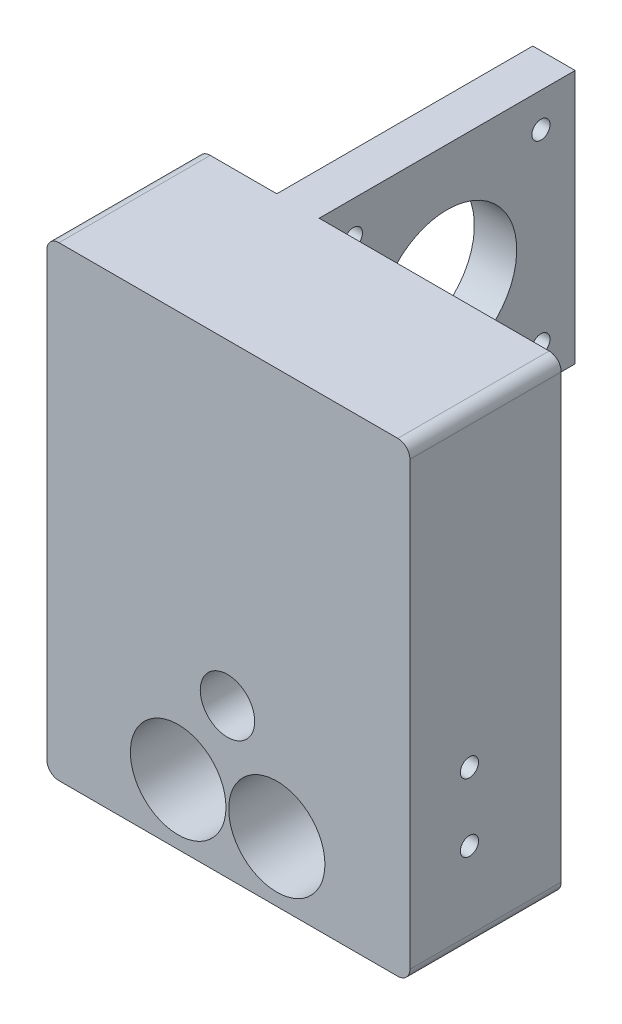
ISO-10303-21;
HEADER;
FILE_DESCRIPTION(('STEP AP214'),'2;1');
FILE_NAME('part.step','',(''),(''),'','','');
FILE_SCHEMA(('AUTOMOTIVE_DESIGN { 1 0 10303 214 1 1 1 1 }'));
ENDSEC;
DATA;
#1=APPLICATION_CONTEXT('core data for automotive mechanical design processes');
#2=APPLICATION_PROTOCOL_DEFINITION('international standard','automotive_design',2000,#1);
#3=PRODUCT_CONTEXT('',#1,'mechanical');
#4=PRODUCT('Part','Part','',(#3));
#5=PRODUCT_RELATED_PRODUCT_CATEGORY('part','',(#4));
#6=PRODUCT_DEFINITION_FORMATION('','',#4);
#7=PRODUCT_DEFINITION_CONTEXT('part definition',#1,'design');
#8=PRODUCT_DEFINITION('design','',#6,#7);
#9=PRODUCT_DEFINITION_SHAPE('','',#8);
#10=(LENGTH_UNIT() NAMED_UNIT(*) SI_UNIT(.MILLI.,.METRE.));
#11=(NAMED_UNIT(*) PLANE_ANGLE_UNIT() SI_UNIT($,.RADIAN.));
#12=(NAMED_UNIT(*) SI_UNIT($,.STERADIAN.) SOLID_ANGLE_UNIT());
#13=UNCERTAINTY_MEASURE_WITH_UNIT(LENGTH_MEASURE(1.E-05),#10,'distance_accuracy_value','');
#14=(GEOMETRIC_REPRESENTATION_CONTEXT(3) GLOBAL_UNCERTAINTY_ASSIGNED_CONTEXT((#13)) GLOBAL_UNIT_ASSIGNED_CONTEXT((#10,
#11,#12)) REPRESENTATION_CONTEXT('',''));
#15=CARTESIAN_POINT('',(0.,0.,0.));
#16=DIRECTION('',(0.,0.,1.));
#17=DIRECTION('',(1.,0.,0.));
#18=AXIS2_PLACEMENT_3D('',#15,#16,#17);
#19=CARTESIAN_POINT('',(69.8451343283582,24.6422595891986,25.));
#20=DIRECTION('',(0.,0.,-1.));
#21=DIRECTION('',(-1.,0.,0.));
#22=AXIS2_PLACEMENT_3D('',#19,#20,#21);
#23=CYLINDRICAL_SURFACE('',#22,4.5);
#24=CARTESIAN_POINT('',(69.8451343283582,24.6422595891986,25.));
#25=DIRECTION('',(0.,0.,1.));
#26=DIRECTION('',(1.,0.,0.));
#27=AXIS2_PLACEMENT_3D('',#24,#25,#26);
#28=CIRCLE('',#27,4.5);
#29=CARTESIAN_POINT('',(74.3451343283582,24.6422595891986,25.));
#30=VERTEX_POINT('',#29);
#31=EDGE_CURVE('E212',#30,#30,#28,.T.);
#32=ORIENTED_EDGE('',*,*,#31,.T.);
#33=EDGE_LOOP('',(#32));
#34=FACE_BOUND('',#33,.T.);
#35=CARTESIAN_POINT('',(69.8451343283582,24.6422595891986,7.5));
#36=DIRECTION('',(0.,0.,-1.));
#37=DIRECTION('',(-1.,0.,0.));
#38=AXIS2_PLACEMENT_3D('',#35,#36,#37);
#39=CIRCLE('',#38,4.5);
#40=CARTESIAN_POINT('',(65.3451343283582,24.6422595891986,7.5));
#41=VERTEX_POINT('',#40);
#42=EDGE_CURVE('E253',#41,#41,#39,.T.);
#43=ORIENTED_EDGE('',*,*,#42,.T.);
#44=EDGE_LOOP('',(#43));
#45=FACE_BOUND('',#44,.T.);
#46=ADVANCED_FACE('F35',(#34,#45),#23,.F.);
#47=CARTESIAN_POINT('',(0.,0.,25.));
#48=DIRECTION('',(0.,1.,0.));
#49=DIRECTION('',(0.,0.,1.));
#50=AXIS2_PLACEMENT_3D('',#47,#48,#49);
#51=PLANE('',#50);
#52=CARTESIAN_POINT('',(48.,0.,12.5));
#53=DIRECTION('',(0.,1.,0.));
#54=DIRECTION('',(0.,0.,1.));
#55=AXIS2_PLACEMENT_3D('',#52,#53,#54);
#56=CIRCLE('',#55,4.3);
#57=CARTESIAN_POINT('',(48.,0.,16.8));
#58=VERTEX_POINT('',#57);
#59=EDGE_CURVE('E204',#58,#58,#56,.T.);
#60=ORIENTED_EDGE('',*,*,#59,.T.);
#61=EDGE_LOOP('',(#60));
#62=FACE_BOUND('',#61,.T.);
#63=CARTESIAN_POINT('',(92.,0.,12.5));
#64=DIRECTION('',(0.,1.,0.));
#65=DIRECTION('',(0.,0.,1.));
#66=AXIS2_PLACEMENT_3D('',#63,#64,#65);
#67=CIRCLE('',#66,4.3);
#68=CARTESIAN_POINT('',(92.,0.,16.8));
#69=VERTEX_POINT('',#68);
#70=EDGE_CURVE('E205',#69,#69,#67,.T.);
#71=ORIENTED_EDGE('',*,*,#70,.T.);
#72=EDGE_LOOP('',(#71));
#73=FACE_BOUND('',#72,.T.);
#74=DIRECTION('',(1.,0.,0.));
#75=VECTOR('',#74,1.);
#76=CARTESIAN_POINT('',(0.,0.,25.));
#77=LINE('',#76,#75);
#78=CARTESIAN_POINT('',(42.,0.,25.));
#79=VERTEX_POINT('',#78);
#80=CARTESIAN_POINT('',(98.,0.,25.));
#81=VERTEX_POINT('',#80);
#82=EDGE_CURVE('E230',#79,#81,#77,.T.);
#83=ORIENTED_EDGE('',*,*,#82,.F.);
#84=DIRECTION('',(0.,0.,-1.));
#85=VECTOR('',#84,1.);
#86=CARTESIAN_POINT('',(42.,0.,0.));
#87=LINE('',#86,#85);
#88=CARTESIAN_POINT('',(42.,0.,0.));
#89=VERTEX_POINT('',#88);
#90=EDGE_CURVE('E11',#79,#89,#87,.T.);
#91=ORIENTED_EDGE('',*,*,#90,.T.);
#92=DIRECTION('',(1.,0.,0.));
#93=VECTOR('',#92,1.);
#94=CARTESIAN_POINT('',(0.,0.,0.));
#95=LINE('',#94,#93);
#96=CARTESIAN_POINT('',(98.,0.,0.));
#97=VERTEX_POINT('',#96);
#98=EDGE_CURVE('E227',#89,#97,#95,.T.);
#99=ORIENTED_EDGE('',*,*,#98,.T.);
#100=DIRECTION('',(0.,0.,-1.));
#101=VECTOR('',#100,1.);
#102=CARTESIAN_POINT('',(98.,0.,25.));
#103=LINE('',#102,#101);
#104=EDGE_CURVE('E43',#97,#81,#103,.F.);
#105=ORIENTED_EDGE('',*,*,#104,.T.);
#106=EDGE_LOOP('',(#83,#91,#99,#105));
#107=FACE_BOUND('',#106,.T.);
#108=ADVANCED_FACE('F433',(#62,#73,#107),#51,.F.);
#109=CARTESIAN_POINT('',(0.,0.,25.));
#110=DIRECTION('',(0.,0.,-1.));
#111=DIRECTION('',(-1.,0.,0.));
#112=AXIS2_PLACEMENT_3D('',#109,#110,#111);
#113=PLANE('',#112);
#114=CARTESIAN_POINT('',(61.7000008998014,9.99458395683269,25.));
#115=DIRECTION('',(0.,0.,1.));
#116=DIRECTION('',(1.,0.,0.));
#117=AXIS2_PLACEMENT_3D('',#114,#115,#116);
#118=CIRCLE('',#117,7.9);
#119=CARTESIAN_POINT('',(69.6000008998014,9.99458395683269,25.));
#120=VERTEX_POINT('',#119);
#121=EDGE_CURVE('E224',#120,#120,#118,.T.);
#122=ORIENTED_EDGE('',*,*,#121,.F.);
#123=EDGE_LOOP('',(#122));
#124=FACE_BOUND('',#123,.T.);
#125=ORIENTED_EDGE('',*,*,#31,.F.);
#126=EDGE_LOOP('',(#125));
#127=FACE_BOUND('',#126,.T.);
#128=CARTESIAN_POINT('',(78.,10.,25.));
#129=DIRECTION('',(0.,0.,1.));
#130=DIRECTION('',(1.,0.,0.));
#131=AXIS2_PLACEMENT_3D('',#128,#129,#130);
#132=CIRCLE('',#131,7.95);
#133=CARTESIAN_POINT('',(85.95,10.,25.));
#134=VERTEX_POINT('',#133);
#135=EDGE_CURVE('E215',#134,#134,#132,.T.);
#136=ORIENTED_EDGE('',*,*,#135,.F.);
#137=EDGE_LOOP('',(#136));
#138=FACE_BOUND('',#137,.T.);
#139=DIRECTION('',(0.,1.,0.));
#140=VECTOR('',#139,1.);
#141=CARTESIAN_POINT('',(100.,0.,25.));
#142=LINE('',#141,#140);
#143=CARTESIAN_POINT('',(100.,2.,25.));
#144=VERTEX_POINT('',#143);
#145=CARTESIAN_POINT('',(100.,74.9999999999998,25.));
#146=VERTEX_POINT('',#145);
#147=EDGE_CURVE('E232',#144,#146,#142,.T.);
#148=ORIENTED_EDGE('',*,*,#147,.T.);
#149=CARTESIAN_POINT('',(98.,74.9999999999998,25.));
#150=DIRECTION('',(0.,0.,-1.));
#151=DIRECTION('',(-1.,0.,0.));
#152=AXIS2_PLACEMENT_3D('',#149,#150,#151);
#153=CIRCLE('',#152,2.);
#154=CARTESIAN_POINT('',(98.,77.,25.));
#155=VERTEX_POINT('',#154);
#156=EDGE_CURVE('E278',#146,#155,#153,.F.);
#157=ORIENTED_EDGE('',*,*,#156,.T.);
#158=DIRECTION('',(-1.,0.,0.));
#159=VECTOR('',#158,1.);
#160=CARTESIAN_POINT('',(100.,77.,25.));
#161=LINE('',#160,#159);
#162=CARTESIAN_POINT('',(42.,77.,25.));
#163=VERTEX_POINT('',#162);
#164=EDGE_CURVE('E172',#155,#163,#161,.T.);
#165=ORIENTED_EDGE('',*,*,#164,.T.);
#166=CARTESIAN_POINT('',(42.,75.0000000000001,25.));
#167=DIRECTION('',(0.,0.,-1.));
#168=DIRECTION('',(-1.,0.,0.));
#169=AXIS2_PLACEMENT_3D('',#166,#167,#168);
#170=CIRCLE('',#169,2.);
#171=CARTESIAN_POINT('',(40.,75.0000000000001,25.));
#172=VERTEX_POINT('',#171);
#173=EDGE_CURVE('E276',#163,#172,#170,.F.);
#174=ORIENTED_EDGE('',*,*,#173,.T.);
#175=DIRECTION('',(0.,1.,0.));
#176=VECTOR('',#175,1.);
#177=CARTESIAN_POINT('',(40.,0.,25.));
#178=LINE('',#177,#176);
#179=CARTESIAN_POINT('',(40.,2.,25.));
#180=VERTEX_POINT('',#179);
#181=EDGE_CURVE('E291',#180,#172,#178,.T.);
#182=ORIENTED_EDGE('',*,*,#181,.F.);
#183=CARTESIAN_POINT('',(42.,2.,25.));
#184=DIRECTION('',(0.,0.,-1.));
#185=DIRECTION('',(-1.,0.,0.));
#186=AXIS2_PLACEMENT_3D('',#183,#184,#185);
#187=CIRCLE('',#186,2.);
#188=EDGE_CURVE('E56',#180,#79,#187,.F.);
#189=ORIENTED_EDGE('',*,*,#188,.T.);
#190=ORIENTED_EDGE('',*,*,#82,.T.);
#191=CARTESIAN_POINT('',(98.,2.,25.));
#192=DIRECTION('',(0.,0.,-1.));
#193=DIRECTION('',(-1.,0.,0.));
#194=AXIS2_PLACEMENT_3D('',#191,#192,#193);
#195=CIRCLE('',#194,2.);
#196=EDGE_CURVE('E273',#81,#144,#195,.F.);
#197=ORIENTED_EDGE('',*,*,#196,.T.);
#198=EDGE_LOOP('',(#148,#157,#165,#174,#182,#189,#190,#197));
#199=FACE_BOUND('',#198,.T.);
#200=ADVANCED_FACE('F330',(#124,#127,#138,#199),#113,.F.);
#201=CARTESIAN_POINT('',(0.,0.,0.));
#202=DIRECTION('',(0.,0.,-1.));
#203=DIRECTION('',(-1.,0.,0.));
#204=AXIS2_PLACEMENT_3D('',#201,#202,#203);
#205=PLANE('',#204);
#206=DIRECTION('',(-1.,0.,0.));
#207=VECTOR('',#206,1.);
#208=CARTESIAN_POINT('',(100.,77.,0.));
#209=LINE('',#208,#207);
#210=CARTESIAN_POINT('',(98.,77.,0.));
#211=VERTEX_POINT('',#210);
#212=CARTESIAN_POINT('',(60.,77.,0.));
#213=VERTEX_POINT('',#212);
#214=EDGE_CURVE('E161',#211,#213,#209,.T.);
#215=ORIENTED_EDGE('',*,*,#214,.F.);
#216=CARTESIAN_POINT('',(98.,74.9999999999998,0.));
#217=DIRECTION('',(0.,0.,-1.));
#218=DIRECTION('',(-1.,0.,0.));
#219=AXIS2_PLACEMENT_3D('',#216,#217,#218);
#220=CIRCLE('',#219,2.);
#221=CARTESIAN_POINT('',(100.,74.9999999999998,0.));
#222=VERTEX_POINT('',#221);
#223=EDGE_CURVE('E266',#211,#222,#220,.T.);
#224=ORIENTED_EDGE('',*,*,#223,.T.);
#225=DIRECTION('',(0.,1.,0.));
#226=VECTOR('',#225,1.);
#227=CARTESIAN_POINT('',(100.,0.,0.));
#228=LINE('',#227,#226);
#229=CARTESIAN_POINT('',(100.,2.,0.));
#230=VERTEX_POINT('',#229);
#231=EDGE_CURVE('E233',#230,#222,#228,.T.);
#232=ORIENTED_EDGE('',*,*,#231,.F.);
#233=CARTESIAN_POINT('',(98.,2.,0.));
#234=DIRECTION('',(0.,0.,-1.));
#235=DIRECTION('',(-1.,0.,0.));
#236=AXIS2_PLACEMENT_3D('',#233,#234,#235);
#237=CIRCLE('',#236,2.);
#238=EDGE_CURVE('E260',#230,#97,#237,.T.);
#239=ORIENTED_EDGE('',*,*,#238,.T.);
#240=ORIENTED_EDGE('',*,*,#98,.F.);
#241=CARTESIAN_POINT('',(42.,2.,0.));
#242=DIRECTION('',(0.,0.,-1.));
#243=DIRECTION('',(-1.,0.,0.));
#244=AXIS2_PLACEMENT_3D('',#241,#242,#243);
#245=CIRCLE('',#244,2.);
#246=CARTESIAN_POINT('',(40.,2.,0.));
#247=VERTEX_POINT('',#246);
#248=EDGE_CURVE('E262',#89,#247,#245,.T.);
#249=ORIENTED_EDGE('',*,*,#248,.T.);
#250=DIRECTION('',(0.,1.,0.));
#251=VECTOR('',#250,1.);
#252=CARTESIAN_POINT('',(40.,0.,0.));
#253=LINE('',#252,#251);
#254=CARTESIAN_POINT('',(40.,75.0000000000001,0.));
#255=VERTEX_POINT('',#254);
#256=EDGE_CURVE('E256',#247,#255,#253,.T.);
#257=ORIENTED_EDGE('',*,*,#256,.T.);
#258=CARTESIAN_POINT('',(42.,75.0000000000001,0.));
#259=DIRECTION('',(0.,0.,-1.));
#260=DIRECTION('',(-1.,0.,0.));
#261=AXIS2_PLACEMENT_3D('',#258,#259,#260);
#262=CIRCLE('',#261,2.);
#263=CARTESIAN_POINT('',(42.,77.,0.));
#264=VERTEX_POINT('',#263);
#265=EDGE_CURVE('E264',#255,#264,#262,.T.);
#266=ORIENTED_EDGE('',*,*,#265,.T.);
#267=CARTESIAN_POINT('',(53.,77.,0.));
#268=VERTEX_POINT('',#267);
#269=EDGE_CURVE('E173',#268,#264,#209,.T.);
#270=ORIENTED_EDGE('',*,*,#269,.F.);
#271=DIRECTION('',(0.,-1.,0.));
#272=VECTOR('',#271,1.);
#273=CARTESIAN_POINT('',(53.,77.,0.));
#274=LINE('',#273,#272);
#275=CARTESIAN_POINT('',(53.,35.,0.));
#276=VERTEX_POINT('',#275);
#277=EDGE_CURVE('E183',#268,#276,#274,.T.);
#278=ORIENTED_EDGE('',*,*,#277,.T.);
#279=DIRECTION('',(1.,0.,0.));
#280=VECTOR('',#279,1.);
#281=CARTESIAN_POINT('',(60.,35.,0.));
#282=LINE('',#281,#280);
#283=CARTESIAN_POINT('',(60.,35.,0.));
#284=VERTEX_POINT('',#283);
#285=EDGE_CURVE('E180',#276,#284,#282,.T.);
#286=ORIENTED_EDGE('',*,*,#285,.T.);
#287=DIRECTION('',(0.,1.,0.));
#288=VECTOR('',#287,1.);
#289=CARTESIAN_POINT('',(60.,77.,0.));
#290=LINE('',#289,#288);
#291=EDGE_CURVE('E176',#284,#213,#290,.T.);
#292=ORIENTED_EDGE('',*,*,#291,.T.);
#293=EDGE_LOOP('',(#215,#224,#232,#239,#240,#249,#257,#266,#270,#278,#286,#292));
#294=FACE_BOUND('',#293,.T.);
#295=DIRECTION('',(-0.780451046040336,0.625216894153177,0.));
#296=VECTOR('',#295,1.);
#297=CARTESIAN_POINT('',(68.6838895653523,17.0518153377911,0.));
#298=LINE('',#297,#296);
#299=CARTESIAN_POINT('',(68.6838895653523,17.0518153377911,0.));
#300=VERTEX_POINT('',#299);
#301=CARTESIAN_POINT('',(62.6909943991268,21.8527049282696,0.));
#302=VERTEX_POINT('',#301);
#303=EDGE_CURVE('E352',#300,#302,#298,.T.);
#304=ORIENTED_EDGE('',*,*,#303,.F.);
#305=DIRECTION('',(-0.931679236232026,-0.363281985204481,0.));
#306=VECTOR('',#305,1.);
#307=CARTESIAN_POINT('',(75.8380294945837,19.8413699987201,0.));
#308=LINE('',#307,#306);
#309=CARTESIAN_POINT('',(75.8380294945837,19.8413699987201,0.));
#310=VERTEX_POINT('',#309);
#311=EDGE_CURVE('E357',#310,#300,#308,.T.);
#312=ORIENTED_EDGE('',*,*,#311,.F.);
#313=DIRECTION('',(-0.15122819019169,-0.988498879357658,0.));
#314=VECTOR('',#313,1.);
#315=CARTESIAN_POINT('',(76.9992742575896,27.4318142501276,0.));
#316=LINE('',#315,#314);
#317=CARTESIAN_POINT('',(76.9992742575896,27.4318142501276,0.));
#318=VERTEX_POINT('',#317);
#319=EDGE_CURVE('E383',#318,#310,#316,.T.);
#320=ORIENTED_EDGE('',*,*,#319,.F.);
#321=DIRECTION('',(0.780451046040336,-0.625216894153177,0.));
#322=VECTOR('',#321,1.);
#323=CARTESIAN_POINT('',(71.0063790913641,32.2327038406061,0.));
#324=LINE('',#323,#322);
#325=CARTESIAN_POINT('',(71.0063790913641,32.2327038406061,0.));
#326=VERTEX_POINT('',#325);
#327=EDGE_CURVE('E380',#326,#318,#324,.T.);
#328=ORIENTED_EDGE('',*,*,#327,.F.);
#329=DIRECTION('',(0.931679236232026,0.363281985204481,0.));
#330=VECTOR('',#329,1.);
#331=CARTESIAN_POINT('',(63.8522391621327,29.4431491796771,0.));
#332=LINE('',#331,#330);
#333=CARTESIAN_POINT('',(63.8522391621327,29.4431491796771,0.));
#334=VERTEX_POINT('',#333);
#335=EDGE_CURVE('E377',#334,#326,#332,.T.);
#336=ORIENTED_EDGE('',*,*,#335,.F.);
#337=DIRECTION('',(0.15122819019169,0.988498879357658,0.));
#338=VECTOR('',#337,1.);
#339=CARTESIAN_POINT('',(62.6909943991268,21.8527049282696,0.));
#340=LINE('',#339,#338);
#341=EDGE_CURVE('E374',#302,#334,#340,.T.);
#342=ORIENTED_EDGE('',*,*,#341,.F.);
#343=EDGE_LOOP('',(#304,#312,#320,#328,#336,#342));
#344=FACE_BOUND('',#343,.T.);
#345=CARTESIAN_POINT('',(78.,10.,0.));
#346=DIRECTION('',(0.,0.,1.));
#347=DIRECTION('',(1.,0.,0.));
#348=AXIS2_PLACEMENT_3D('',#345,#346,#347);
#349=CIRCLE('',#348,7.95);
#350=CARTESIAN_POINT('',(85.95,10.,0.));
#351=VERTEX_POINT('',#350);
#352=EDGE_CURVE('E219',#351,#351,#349,.T.);
#353=ORIENTED_EDGE('',*,*,#352,.T.);
#354=EDGE_LOOP('',(#353));
#355=FACE_BOUND('',#354,.T.);
#356=CARTESIAN_POINT('',(61.7000008998014,9.99458395683269,0.));
#357=DIRECTION('',(0.,0.,1.));
#358=DIRECTION('',(1.,0.,0.));
#359=AXIS2_PLACEMENT_3D('',#356,#357,#358);
#360=CIRCLE('',#359,7.9);
#361=CARTESIAN_POINT('',(69.6000008998014,9.99458395683269,0.));
#362=VERTEX_POINT('',#361);
#363=EDGE_CURVE('E218',#362,#362,#360,.T.);
#364=ORIENTED_EDGE('',*,*,#363,.T.);
#365=EDGE_LOOP('',(#364));
#366=FACE_BOUND('',#365,.T.);
#367=ADVANCED_FACE('F177',(#294,#344,#355,#366),#205,.T.);
#368=CARTESIAN_POINT('',(100.,0.,25.));
#369=DIRECTION('',(-1.,0.,0.));
#370=DIRECTION('',(0.,0.,1.));
#371=AXIS2_PLACEMENT_3D('',#368,#369,#370);
#372=PLANE('',#371);
#373=CARTESIAN_POINT('',(100.,14.7518761899252,15.163954836464));
#374=DIRECTION('',(1.,0.,0.));
#375=DIRECTION('',(0.,0.,-1.));
#376=AXIS2_PLACEMENT_3D('',#373,#374,#375);
#377=CIRCLE('',#376,1.5);
#378=CARTESIAN_POINT('',(100.,14.7518761899252,13.663954836464));
#379=VERTEX_POINT('',#378);
#380=EDGE_CURVE('E332',#379,#379,#377,.T.);
#381=ORIENTED_EDGE('',*,*,#380,.F.);
#382=EDGE_LOOP('',(#381));
#383=FACE_BOUND('',#382,.T.);
#384=CARTESIAN_POINT('',(100.,26.0000000000001,15.163954836464));
#385=DIRECTION('',(1.,0.,0.));
#386=DIRECTION('',(0.,0.,-1.));
#387=AXIS2_PLACEMENT_3D('',#384,#385,#386);
#388=CIRCLE('',#387,1.5);
#389=CARTESIAN_POINT('',(100.,26.0000000000001,13.663954836464));
#390=VERTEX_POINT('',#389);
#391=EDGE_CURVE('E339',#390,#390,#388,.T.);
#392=ORIENTED_EDGE('',*,*,#391,.F.);
#393=EDGE_LOOP('',(#392));
#394=FACE_BOUND('',#393,.T.);
#395=ORIENTED_EDGE('',*,*,#231,.T.);
#396=DIRECTION('',(0.,0.,-1.));
#397=VECTOR('',#396,1.);
#398=CARTESIAN_POINT('',(100.,74.9999999999998,25.));
#399=LINE('',#398,#397);
#400=EDGE_CURVE('E271',#222,#146,#399,.F.);
#401=ORIENTED_EDGE('',*,*,#400,.T.);
#402=ORIENTED_EDGE('',*,*,#147,.F.);
#403=DIRECTION('',(0.,0.,-1.));
#404=VECTOR('',#403,1.);
#405=CARTESIAN_POINT('',(100.,2.,25.));
#406=LINE('',#405,#404);
#407=EDGE_CURVE('E268',#144,#230,#406,.T.);
#408=ORIENTED_EDGE('',*,*,#407,.T.);
#409=EDGE_LOOP('',(#395,#401,#402,#408));
#410=FACE_BOUND('',#409,.T.);
#411=ADVANCED_FACE('F450',(#383,#394,#410),#372,.F.);
#412=CARTESIAN_POINT('',(61.7000008998014,9.99458395683269,25.));
#413=DIRECTION('',(0.,0.,-1.));
#414=DIRECTION('',(-1.,0.,0.));
#415=AXIS2_PLACEMENT_3D('',#412,#413,#414);
#416=CYLINDRICAL_SURFACE('',#415,7.9);
#417=ORIENTED_EDGE('',*,*,#121,.T.);
#418=EDGE_LOOP('',(#417));
#419=FACE_BOUND('',#418,.T.);
#420=ORIENTED_EDGE('',*,*,#363,.F.);
#421=EDGE_LOOP('',(#420));
#422=FACE_BOUND('',#421,.T.);
#423=ADVANCED_FACE('F447',(#419,#422),#416,.F.);
#424=CARTESIAN_POINT('',(78.,10.,25.));
#425=DIRECTION('',(0.,0.,-1.));
#426=DIRECTION('',(-1.,0.,0.));
#427=AXIS2_PLACEMENT_3D('',#424,#425,#426);
#428=CYLINDRICAL_SURFACE('',#427,7.95);
#429=ORIENTED_EDGE('',*,*,#135,.T.);
#430=EDGE_LOOP('',(#429));
#431=FACE_BOUND('',#430,.T.);
#432=ORIENTED_EDGE('',*,*,#352,.F.);
#433=EDGE_LOOP('',(#432));
#434=FACE_BOUND('',#433,.T.);
#435=ADVANCED_FACE('F445',(#431,#434),#428,.F.);
#436=CARTESIAN_POINT('',(48.,10.,12.5));
#437=DIRECTION('',(0.,-1.,0.));
#438=DIRECTION('',(0.,0.,-1.));
#439=AXIS2_PLACEMENT_3D('',#436,#437,#438);
#440=CYLINDRICAL_SURFACE('',#439,4.3);
#441=CARTESIAN_POINT('',(48.,10.,12.5));
#442=DIRECTION('',(0.,1.,0.));
#443=DIRECTION('',(0.,0.,1.));
#444=AXIS2_PLACEMENT_3D('',#441,#442,#443);
#445=CIRCLE('',#444,4.3);
#446=CARTESIAN_POINT('',(48.,10.,16.8));
#447=VERTEX_POINT('',#446);
#448=EDGE_CURVE('E209',#447,#447,#445,.T.);
#449=ORIENTED_EDGE('',*,*,#448,.T.);
#450=EDGE_LOOP('',(#449));
#451=FACE_BOUND('',#450,.T.);
#452=ORIENTED_EDGE('',*,*,#59,.F.);
#453=EDGE_LOOP('',(#452));
#454=FACE_BOUND('',#453,.T.);
#455=ADVANCED_FACE('F732',(#451,#454),#440,.F.);
#456=CARTESIAN_POINT('',(48.,10.,12.5));
#457=DIRECTION('',(0.,1.,0.));
#458=DIRECTION('',(0.,0.,1.));
#459=AXIS2_PLACEMENT_3D('',#456,#457,#458);
#460=PLANE('',#459);
#461=ORIENTED_EDGE('',*,*,#448,.F.);
#462=EDGE_LOOP('',(#461));
#463=FACE_BOUND('',#462,.T.);
#464=ADVANCED_FACE('F722',(#463),#460,.F.);
#465=CARTESIAN_POINT('',(92.,10.,12.5));
#466=DIRECTION('',(0.,-1.,0.));
#467=DIRECTION('',(0.,0.,-1.));
#468=AXIS2_PLACEMENT_3D('',#465,#466,#467);
#469=CYLINDRICAL_SURFACE('',#468,4.3);
#470=CARTESIAN_POINT('',(92.,10.,12.5));
#471=DIRECTION('',(0.,1.,0.));
#472=DIRECTION('',(0.,0.,1.));
#473=AXIS2_PLACEMENT_3D('',#470,#471,#472);
#474=CIRCLE('',#473,4.3);
#475=CARTESIAN_POINT('',(92.,10.,16.8));
#476=VERTEX_POINT('',#475);
#477=EDGE_CURVE('E201',#476,#476,#474,.T.);
#478=ORIENTED_EDGE('',*,*,#477,.T.);
#479=EDGE_LOOP('',(#478));
#480=FACE_BOUND('',#479,.T.);
#481=ORIENTED_EDGE('',*,*,#70,.F.);
#482=EDGE_LOOP('',(#481));
#483=FACE_BOUND('',#482,.T.);
#484=ADVANCED_FACE('F712',(#480,#483),#469,.F.);
#485=CARTESIAN_POINT('',(92.,10.,12.5));
#486=DIRECTION('',(0.,1.,0.));
#487=DIRECTION('',(0.,0.,1.));
#488=AXIS2_PLACEMENT_3D('',#485,#486,#487);
#489=PLANE('',#488);
#490=ORIENTED_EDGE('',*,*,#477,.F.);
#491=EDGE_LOOP('',(#490));
#492=FACE_BOUND('',#491,.T.);
#493=ADVANCED_FACE('F552',(#492),#489,.F.);
#494=CARTESIAN_POINT('',(60.,77.,-42.3));
#495=DIRECTION('',(1.,0.,0.));
#496=DIRECTION('',(0.,1.,0.));
#497=AXIS2_PLACEMENT_3D('',#494,#495,#496);
#498=PLANE('',#497);
#499=CARTESIAN_POINT('',(60.,56.15,-21.15));
#500=DIRECTION('',(1.,0.,0.));
#501=DIRECTION('',(0.,1.,0.));
#502=AXIS2_PLACEMENT_3D('',#499,#500,#501);
#503=CIRCLE('',#502,11.5);
#504=CARTESIAN_POINT('',(60.,67.65,-21.15));
#505=VERTEX_POINT('',#504);
#506=EDGE_CURVE('E349',#505,#505,#503,.T.);
#507=ORIENTED_EDGE('',*,*,#506,.F.);
#508=EDGE_LOOP('',(#507));
#509=FACE_BOUND('',#508,.T.);
#510=CARTESIAN_POINT('',(60.,40.6500000000001,-36.65));
#511=DIRECTION('',(1.,0.,0.));
#512=DIRECTION('',(0.,1.,0.));
#513=AXIS2_PLACEMENT_3D('',#510,#511,#512);
#514=CIRCLE('',#513,1.5);
#515=CARTESIAN_POINT('',(60.,42.1500000000001,-36.65));
#516=VERTEX_POINT('',#515);
#517=EDGE_CURVE('E247',#516,#516,#514,.T.);
#518=ORIENTED_EDGE('',*,*,#517,.F.);
#519=EDGE_LOOP('',(#518));
#520=FACE_BOUND('',#519,.T.);
#521=CARTESIAN_POINT('',(60.,40.6500000000001,-5.65));
#522=DIRECTION('',(1.,0.,0.));
#523=DIRECTION('',(0.,1.,0.));
#524=AXIS2_PLACEMENT_3D('',#521,#522,#523);
#525=CIRCLE('',#524,1.5);
#526=CARTESIAN_POINT('',(60.,42.1500000000001,-5.65));
#527=VERTEX_POINT('',#526);
#528=EDGE_CURVE('E303',#527,#527,#525,.T.);
#529=ORIENTED_EDGE('',*,*,#528,.F.);
#530=EDGE_LOOP('',(#529));
#531=FACE_BOUND('',#530,.T.);
#532=CARTESIAN_POINT('',(60.,71.3500000000001,-5.65));
#533=DIRECTION('',(1.,0.,0.));
#534=DIRECTION('',(0.,1.,0.));
#535=AXIS2_PLACEMENT_3D('',#532,#533,#534);
#536=CIRCLE('',#535,1.5);
#537=CARTESIAN_POINT('',(60.,72.8500000000001,-5.65));
#538=VERTEX_POINT('',#537);
#539=EDGE_CURVE('E297',#538,#538,#536,.T.);
#540=ORIENTED_EDGE('',*,*,#539,.F.);
#541=EDGE_LOOP('',(#540));
#542=FACE_BOUND('',#541,.T.);
#543=CARTESIAN_POINT('',(60.,71.3500000000001,-36.65));
#544=DIRECTION('',(1.,0.,0.));
#545=DIRECTION('',(0.,1.,0.));
#546=AXIS2_PLACEMENT_3D('',#543,#544,#545);
#547=CIRCLE('',#546,1.5);
#548=CARTESIAN_POINT('',(60.,72.8500000000001,-36.65));
#549=VERTEX_POINT('',#548);
#550=EDGE_CURVE('E242',#549,#549,#547,.T.);
#551=ORIENTED_EDGE('',*,*,#550,.F.);
#552=EDGE_LOOP('',(#551));
#553=FACE_BOUND('',#552,.T.);
#554=ORIENTED_EDGE('',*,*,#291,.F.);
#555=DIRECTION('',(0.,0.,1.));
#556=VECTOR('',#555,1.);
#557=CARTESIAN_POINT('',(60.,35.,-42.3));
#558=LINE('',#557,#556);
#559=CARTESIAN_POINT('',(60.,35.,-42.3));
#560=VERTEX_POINT('',#559);
#561=EDGE_CURVE('E208',#560,#284,#558,.T.);
#562=ORIENTED_EDGE('',*,*,#561,.F.);
#563=DIRECTION('',(0.,1.,0.));
#564=VECTOR('',#563,1.);
#565=CARTESIAN_POINT('',(60.,77.,-42.3));
#566=LINE('',#565,#564);
#567=CARTESIAN_POINT('',(60.,77.,-42.3));
#568=VERTEX_POINT('',#567);
#569=EDGE_CURVE('E189',#560,#568,#566,.T.);
#570=ORIENTED_EDGE('',*,*,#569,.T.);
#571=DIRECTION('',(0.,0.,1.));
#572=VECTOR('',#571,1.);
#573=CARTESIAN_POINT('',(60.,77.,-42.3));
#574=LINE('',#573,#572);
#575=EDGE_CURVE('E167',#568,#213,#574,.T.);
#576=ORIENTED_EDGE('',*,*,#575,.T.);
#577=EDGE_LOOP('',(#554,#562,#570,#576));
#578=FACE_BOUND('',#577,.T.);
#579=ADVANCED_FACE('F187',(#509,#520,#531,#542,#553,#578),#498,.T.);
#580=CARTESIAN_POINT('',(60.,35.,-42.3));
#581=DIRECTION('',(0.,-1.,0.));
#582=DIRECTION('',(1.,0.,0.));
#583=AXIS2_PLACEMENT_3D('',#580,#581,#582);
#584=PLANE('',#583);
#585=ORIENTED_EDGE('',*,*,#285,.F.);
#586=DIRECTION('',(0.,0.,1.));
#587=VECTOR('',#586,1.);
#588=CARTESIAN_POINT('',(53.,35.,-42.3));
#589=LINE('',#588,#587);
#590=CARTESIAN_POINT('',(53.,35.,-42.3));
#591=VERTEX_POINT('',#590);
#592=EDGE_CURVE('E194',#591,#276,#589,.T.);
#593=ORIENTED_EDGE('',*,*,#592,.F.);
#594=DIRECTION('',(1.,0.,0.));
#595=VECTOR('',#594,1.);
#596=CARTESIAN_POINT('',(60.,35.,-42.3));
#597=LINE('',#596,#595);
#598=EDGE_CURVE('E191',#591,#560,#597,.T.);
#599=ORIENTED_EDGE('',*,*,#598,.T.);
#600=ORIENTED_EDGE('',*,*,#561,.T.);
#601=EDGE_LOOP('',(#585,#593,#599,#600));
#602=FACE_BOUND('',#601,.T.);
#603=ADVANCED_FACE('F324',(#602),#584,.T.);
#604=CARTESIAN_POINT('',(53.,77.,-42.3));
#605=DIRECTION('',(-1.,0.,0.));
#606=DIRECTION('',(0.,-1.,0.));
#607=AXIS2_PLACEMENT_3D('',#604,#605,#606);
#608=PLANE('',#607);
#609=CARTESIAN_POINT('',(53.,56.15,-21.15));
#610=DIRECTION('',(-1.,0.,0.));
#611=DIRECTION('',(0.,0.,1.));
#612=AXIS2_PLACEMENT_3D('',#609,#610,#611);
#613=CIRCLE('',#612,11.5);
#614=CARTESIAN_POINT('',(53.,56.15,-9.65));
#615=VERTEX_POINT('',#614);
#616=EDGE_CURVE('E344',#615,#615,#613,.T.);
#617=ORIENTED_EDGE('',*,*,#616,.F.);
#618=EDGE_LOOP('',(#617));
#619=FACE_BOUND('',#618,.T.);
#620=CARTESIAN_POINT('',(53.,40.6500000000001,-36.65));
#621=DIRECTION('',(-1.,0.,0.));
#622=DIRECTION('',(0.,-1.,0.));
#623=AXIS2_PLACEMENT_3D('',#620,#621,#622);
#624=CIRCLE('',#623,1.5);
#625=CARTESIAN_POINT('',(53.,39.1500000000001,-36.65));
#626=VERTEX_POINT('',#625);
#627=EDGE_CURVE('E250',#626,#626,#624,.T.);
#628=ORIENTED_EDGE('',*,*,#627,.F.);
#629=EDGE_LOOP('',(#628));
#630=FACE_BOUND('',#629,.T.);
#631=CARTESIAN_POINT('',(53.,40.6500000000001,-5.65));
#632=DIRECTION('',(-1.,0.,0.));
#633=DIRECTION('',(0.,-1.,0.));
#634=AXIS2_PLACEMENT_3D('',#631,#632,#633);
#635=CIRCLE('',#634,1.5);
#636=CARTESIAN_POINT('',(53.,39.1500000000001,-5.65));
#637=VERTEX_POINT('',#636);
#638=EDGE_CURVE('E246',#637,#637,#635,.T.);
#639=ORIENTED_EDGE('',*,*,#638,.F.);
#640=EDGE_LOOP('',(#639));
#641=FACE_BOUND('',#640,.T.);
#642=CARTESIAN_POINT('',(53.,71.3500000000001,-5.65));
#643=DIRECTION('',(-1.,0.,0.));
#644=DIRECTION('',(0.,-1.,0.));
#645=AXIS2_PLACEMENT_3D('',#642,#643,#644);
#646=CIRCLE('',#645,1.5);
#647=CARTESIAN_POINT('',(53.,69.8500000000001,-5.65));
#648=VERTEX_POINT('',#647);
#649=EDGE_CURVE('E243',#648,#648,#646,.T.);
#650=ORIENTED_EDGE('',*,*,#649,.F.);
#651=EDGE_LOOP('',(#650));
#652=FACE_BOUND('',#651,.T.);
#653=CARTESIAN_POINT('',(53.,71.3500000000001,-36.65));
#654=DIRECTION('',(-1.,0.,0.));
#655=DIRECTION('',(0.,-1.,0.));
#656=AXIS2_PLACEMENT_3D('',#653,#654,#655);
#657=CIRCLE('',#656,1.5);
#658=CARTESIAN_POINT('',(53.,69.8500000000001,-36.65));
#659=VERTEX_POINT('',#658);
#660=EDGE_CURVE('E184',#659,#659,#657,.T.);
#661=ORIENTED_EDGE('',*,*,#660,.F.);
#662=EDGE_LOOP('',(#661));
#663=FACE_BOUND('',#662,.T.);
#664=ORIENTED_EDGE('',*,*,#277,.F.);
#665=DIRECTION('',(0.,0.,1.));
#666=VECTOR('',#665,1.);
#667=CARTESIAN_POINT('',(53.,77.,-42.3));
#668=LINE('',#667,#666);
#669=CARTESIAN_POINT('',(53.,77.,-42.3));
#670=VERTEX_POINT('',#669);
#671=EDGE_CURVE('E190',#670,#268,#668,.T.);
#672=ORIENTED_EDGE('',*,*,#671,.F.);
#673=DIRECTION('',(0.,-1.,0.));
#674=VECTOR('',#673,1.);
#675=CARTESIAN_POINT('',(53.,77.,-42.3));
#676=LINE('',#675,#674);
#677=EDGE_CURVE('E197',#670,#591,#676,.T.);
#678=ORIENTED_EDGE('',*,*,#677,.T.);
#679=ORIENTED_EDGE('',*,*,#592,.T.);
#680=EDGE_LOOP('',(#664,#672,#678,#679));
#681=FACE_BOUND('',#680,.T.);
#682=ADVANCED_FACE('F320',(#619,#630,#641,#652,#663,#681),#608,.T.);
#683=CARTESIAN_POINT('',(60.,77.,-42.3));
#684=DIRECTION('',(0.,1.,0.));
#685=DIRECTION('',(-1.,0.,0.));
#686=AXIS2_PLACEMENT_3D('',#683,#684,#685);
#687=PLANE('',#686);
#688=ORIENTED_EDGE('',*,*,#164,.F.);
#689=DIRECTION('',(0.,0.,-1.));
#690=VECTOR('',#689,1.);
#691=CARTESIAN_POINT('',(98.,76.9999999999998,0.));
#692=LINE('',#691,#690);
#693=EDGE_CURVE('E170',#155,#211,#692,.T.);
#694=ORIENTED_EDGE('',*,*,#693,.T.);
#695=ORIENTED_EDGE('',*,*,#214,.T.);
#696=ORIENTED_EDGE('',*,*,#575,.F.);
#697=DIRECTION('',(-1.,0.,0.));
#698=VECTOR('',#697,1.);
#699=CARTESIAN_POINT('',(60.,77.,-42.3));
#700=LINE('',#699,#698);
#701=EDGE_CURVE('E311',#568,#670,#700,.T.);
#702=ORIENTED_EDGE('',*,*,#701,.T.);
#703=ORIENTED_EDGE('',*,*,#671,.T.);
#704=ORIENTED_EDGE('',*,*,#269,.T.);
#705=DIRECTION('',(0.,0.,-1.));
#706=VECTOR('',#705,1.);
#707=CARTESIAN_POINT('',(42.,77.0000000000001,-42.3));
#708=LINE('',#707,#706);
#709=EDGE_CURVE('E236',#264,#163,#708,.F.);
#710=ORIENTED_EDGE('',*,*,#709,.T.);
#711=EDGE_LOOP('',(#688,#694,#695,#696,#702,#703,#704,#710));
#712=FACE_BOUND('',#711,.T.);
#713=ADVANCED_FACE('F164',(#712),#687,.T.);
#714=CARTESIAN_POINT('',(0.,0.,-42.3));
#715=DIRECTION('',(0.,0.,-1.));
#716=DIRECTION('',(-1.,0.,0.));
#717=AXIS2_PLACEMENT_3D('',#714,#715,#716);
#718=PLANE('',#717);
#719=ORIENTED_EDGE('',*,*,#569,.F.);
#720=ORIENTED_EDGE('',*,*,#598,.F.);
#721=ORIENTED_EDGE('',*,*,#677,.F.);
#722=ORIENTED_EDGE('',*,*,#701,.F.);
#723=EDGE_LOOP('',(#719,#720,#721,#722));
#724=FACE_BOUND('',#723,.T.);
#725=ADVANCED_FACE('F326',(#724),#718,.T.);
#726=CARTESIAN_POINT('',(48.,71.3500000000001,-36.65));
#727=DIRECTION('',(1.,0.,0.));
#728=DIRECTION('',(0.,1.,0.));
#729=AXIS2_PLACEMENT_3D('',#726,#727,#728);
#730=CYLINDRICAL_SURFACE('',#729,1.5);
#731=ORIENTED_EDGE('',*,*,#660,.T.);
#732=EDGE_LOOP('',(#731));
#733=FACE_BOUND('',#732,.T.);
#734=ORIENTED_EDGE('',*,*,#550,.T.);
#735=EDGE_LOOP('',(#734));
#736=FACE_BOUND('',#735,.T.);
#737=ADVANCED_FACE('F680',(#733,#736),#730,.F.);
#738=CARTESIAN_POINT('',(48.,71.3500000000001,-5.65));
#739=DIRECTION('',(1.,0.,0.));
#740=DIRECTION('',(0.,1.,0.));
#741=AXIS2_PLACEMENT_3D('',#738,#739,#740);
#742=CYLINDRICAL_SURFACE('',#741,1.5);
#743=ORIENTED_EDGE('',*,*,#649,.T.);
#744=EDGE_LOOP('',(#743));
#745=FACE_BOUND('',#744,.T.);
#746=ORIENTED_EDGE('',*,*,#539,.T.);
#747=EDGE_LOOP('',(#746));
#748=FACE_BOUND('',#747,.T.);
#749=ADVANCED_FACE('F670',(#745,#748),#742,.F.);
#750=CARTESIAN_POINT('',(48.,40.6500000000001,-5.65));
#751=DIRECTION('',(1.,0.,0.));
#752=DIRECTION('',(0.,1.,0.));
#753=AXIS2_PLACEMENT_3D('',#750,#751,#752);
#754=CYLINDRICAL_SURFACE('',#753,1.5);
#755=ORIENTED_EDGE('',*,*,#638,.T.);
#756=EDGE_LOOP('',(#755));
#757=FACE_BOUND('',#756,.T.);
#758=ORIENTED_EDGE('',*,*,#528,.T.);
#759=EDGE_LOOP('',(#758));
#760=FACE_BOUND('',#759,.T.);
#761=ADVANCED_FACE('F660',(#757,#760),#754,.F.);
#762=CARTESIAN_POINT('',(48.,40.6500000000001,-36.65));
#763=DIRECTION('',(1.,0.,0.));
#764=DIRECTION('',(0.,1.,0.));
#765=AXIS2_PLACEMENT_3D('',#762,#763,#764);
#766=CYLINDRICAL_SURFACE('',#765,1.5);
#767=ORIENTED_EDGE('',*,*,#627,.T.);
#768=EDGE_LOOP('',(#767));
#769=FACE_BOUND('',#768,.T.);
#770=ORIENTED_EDGE('',*,*,#517,.T.);
#771=EDGE_LOOP('',(#770));
#772=FACE_BOUND('',#771,.T.);
#773=ADVANCED_FACE('F508',(#769,#772),#766,.F.);
#774=CARTESIAN_POINT('',(40.,0.,25.));
#775=DIRECTION('',(-1.,0.,0.));
#776=DIRECTION('',(0.,0.,1.));
#777=AXIS2_PLACEMENT_3D('',#774,#775,#776);
#778=PLANE('',#777);
#779=ORIENTED_EDGE('',*,*,#181,.T.);
#780=DIRECTION('',(0.,0.,-1.));
#781=VECTOR('',#780,1.);
#782=CARTESIAN_POINT('',(40.,75.0000000000001,25.));
#783=LINE('',#782,#781);
#784=EDGE_CURVE('E282',#172,#255,#783,.T.);
#785=ORIENTED_EDGE('',*,*,#784,.T.);
#786=ORIENTED_EDGE('',*,*,#256,.F.);
#787=DIRECTION('',(0.,0.,-1.));
#788=VECTOR('',#787,1.);
#789=CARTESIAN_POINT('',(40.,2.,25.));
#790=LINE('',#789,#788);
#791=EDGE_CURVE('E280',#247,#180,#790,.F.);
#792=ORIENTED_EDGE('',*,*,#791,.T.);
#793=EDGE_LOOP('',(#779,#785,#786,#792));
#794=FACE_BOUND('',#793,.T.);
#795=ADVANCED_FACE('F289',(#794),#778,.T.);
#796=CARTESIAN_POINT('',(68.6838895653523,17.0518153377911,7.5));
#797=DIRECTION('',(-0.625216894153177,-0.780451046040336,0.));
#798=DIRECTION('',(0.780451046040336,-0.625216894153177,0.));
#799=AXIS2_PLACEMENT_3D('',#796,#797,#798);
#800=PLANE('',#799);
#801=ORIENTED_EDGE('',*,*,#303,.T.);
#802=DIRECTION('',(0.,0.,-1.));
#803=VECTOR('',#802,1.);
#804=CARTESIAN_POINT('',(62.6909943991268,21.8527049282696,7.5));
#805=LINE('',#804,#803);
#806=CARTESIAN_POINT('',(62.6909943991268,21.8527049282696,7.5));
#807=VERTEX_POINT('',#806);
#808=EDGE_CURVE('E372',#807,#302,#805,.T.);
#809=ORIENTED_EDGE('',*,*,#808,.F.);
#810=DIRECTION('',(-0.780451046040336,0.625216894153177,0.));
#811=VECTOR('',#810,1.);
#812=CARTESIAN_POINT('',(68.6838895653523,17.0518153377911,7.5));
#813=LINE('',#812,#811);
#814=CARTESIAN_POINT('',(68.6838895653523,17.0518153377911,7.5));
#815=VERTEX_POINT('',#814);
#816=EDGE_CURVE('E353',#815,#807,#813,.T.);
#817=ORIENTED_EDGE('',*,*,#816,.F.);
#818=DIRECTION('',(0.,0.,-1.));
#819=VECTOR('',#818,1.);
#820=CARTESIAN_POINT('',(68.6838895653523,17.0518153377911,7.5));
#821=LINE('',#820,#819);
#822=EDGE_CURVE('E257',#815,#300,#821,.T.);
#823=ORIENTED_EDGE('',*,*,#822,.T.);
#824=EDGE_LOOP('',(#801,#809,#817,#823));
#825=FACE_BOUND('',#824,.T.);
#826=ADVANCED_FACE('F416',(#825),#800,.F.);
#827=CARTESIAN_POINT('',(75.8380294945837,19.8413699987201,7.5));
#828=DIRECTION('',(0.363281985204481,-0.931679236232026,0.));
#829=DIRECTION('',(0.931679236232026,0.363281985204481,0.));
#830=AXIS2_PLACEMENT_3D('',#827,#828,#829);
#831=PLANE('',#830);
#832=ORIENTED_EDGE('',*,*,#311,.T.);
#833=ORIENTED_EDGE('',*,*,#822,.F.);
#834=DIRECTION('',(-0.931679236232026,-0.363281985204481,0.));
#835=VECTOR('',#834,1.);
#836=CARTESIAN_POINT('',(75.8380294945837,19.8413699987201,7.5));
#837=LINE('',#836,#835);
#838=CARTESIAN_POINT('',(75.8380294945837,19.8413699987201,7.5));
#839=VERTEX_POINT('',#838);
#840=EDGE_CURVE('E369',#839,#815,#837,.T.);
#841=ORIENTED_EDGE('',*,*,#840,.F.);
#842=DIRECTION('',(0.,0.,-1.));
#843=VECTOR('',#842,1.);
#844=CARTESIAN_POINT('',(75.8380294945837,19.8413699987201,7.5));
#845=LINE('',#844,#843);
#846=EDGE_CURVE('E389',#839,#310,#845,.T.);
#847=ORIENTED_EDGE('',*,*,#846,.T.);
#848=EDGE_LOOP('',(#832,#833,#841,#847));
#849=FACE_BOUND('',#848,.T.);
#850=ADVANCED_FACE('F418',(#849),#831,.F.);
#851=CARTESIAN_POINT('',(76.9992742575896,27.4318142501276,7.5));
#852=DIRECTION('',(0.988498879357658,-0.15122819019169,0.));
#853=DIRECTION('',(0.15122819019169,0.988498879357658,0.));
#854=AXIS2_PLACEMENT_3D('',#851,#852,#853);
#855=PLANE('',#854);
#856=ORIENTED_EDGE('',*,*,#319,.T.);
#857=ORIENTED_EDGE('',*,*,#846,.F.);
#858=DIRECTION('',(-0.15122819019169,-0.988498879357658,0.));
#859=VECTOR('',#858,1.);
#860=CARTESIAN_POINT('',(76.9992742575896,27.4318142501276,7.5));
#861=LINE('',#860,#859);
#862=CARTESIAN_POINT('',(76.9992742575896,27.4318142501276,7.5));
#863=VERTEX_POINT('',#862);
#864=EDGE_CURVE('E366',#863,#839,#861,.T.);
#865=ORIENTED_EDGE('',*,*,#864,.F.);
#866=DIRECTION('',(0.,0.,-1.));
#867=VECTOR('',#866,1.);
#868=CARTESIAN_POINT('',(76.9992742575896,27.4318142501276,7.5));
#869=LINE('',#868,#867);
#870=EDGE_CURVE('E391',#863,#318,#869,.T.);
#871=ORIENTED_EDGE('',*,*,#870,.T.);
#872=EDGE_LOOP('',(#856,#857,#865,#871));
#873=FACE_BOUND('',#872,.T.);
#874=ADVANCED_FACE('F420',(#873),#855,.F.);
#875=CARTESIAN_POINT('',(71.0063790913641,32.2327038406061,7.5));
#876=DIRECTION('',(0.625216894153177,0.780451046040336,0.));
#877=DIRECTION('',(-0.780451046040336,0.625216894153177,0.));
#878=AXIS2_PLACEMENT_3D('',#875,#876,#877);
#879=PLANE('',#878);
#880=ORIENTED_EDGE('',*,*,#327,.T.);
#881=ORIENTED_EDGE('',*,*,#870,.F.);
#882=DIRECTION('',(0.780451046040336,-0.625216894153177,0.));
#883=VECTOR('',#882,1.);
#884=CARTESIAN_POINT('',(71.0063790913641,32.2327038406061,7.5));
#885=LINE('',#884,#883);
#886=CARTESIAN_POINT('',(71.0063790913641,32.2327038406061,7.5));
#887=VERTEX_POINT('',#886);
#888=EDGE_CURVE('E363',#887,#863,#885,.T.);
#889=ORIENTED_EDGE('',*,*,#888,.F.);
#890=DIRECTION('',(0.,0.,-1.));
#891=VECTOR('',#890,1.);
#892=CARTESIAN_POINT('',(71.0063790913641,32.2327038406061,7.5));
#893=LINE('',#892,#891);
#894=EDGE_CURVE('E393',#887,#326,#893,.T.);
#895=ORIENTED_EDGE('',*,*,#894,.T.);
#896=EDGE_LOOP('',(#880,#881,#889,#895));
#897=FACE_BOUND('',#896,.T.);
#898=ADVANCED_FACE('F423',(#897),#879,.F.);
#899=CARTESIAN_POINT('',(63.8522391621327,29.4431491796771,7.5));
#900=DIRECTION('',(-0.363281985204481,0.931679236232026,0.));
#901=DIRECTION('',(-0.931679236232026,-0.363281985204481,0.));
#902=AXIS2_PLACEMENT_3D('',#899,#900,#901);
#903=PLANE('',#902);
#904=ORIENTED_EDGE('',*,*,#335,.T.);
#905=ORIENTED_EDGE('',*,*,#894,.F.);
#906=DIRECTION('',(0.931679236232026,0.363281985204481,0.));
#907=VECTOR('',#906,1.);
#908=CARTESIAN_POINT('',(63.8522391621327,29.4431491796771,7.5));
#909=LINE('',#908,#907);
#910=CARTESIAN_POINT('',(63.8522391621327,29.4431491796771,7.5));
#911=VERTEX_POINT('',#910);
#912=EDGE_CURVE('E360',#911,#887,#909,.T.);
#913=ORIENTED_EDGE('',*,*,#912,.F.);
#914=DIRECTION('',(0.,0.,-1.));
#915=VECTOR('',#914,1.);
#916=CARTESIAN_POINT('',(63.8522391621327,29.4431491796771,7.5));
#917=LINE('',#916,#915);
#918=EDGE_CURVE('E395',#911,#334,#917,.T.);
#919=ORIENTED_EDGE('',*,*,#918,.T.);
#920=EDGE_LOOP('',(#904,#905,#913,#919));
#921=FACE_BOUND('',#920,.T.);
#922=ADVANCED_FACE('F410',(#921),#903,.F.);
#923=CARTESIAN_POINT('',(62.6909943991268,21.8527049282696,7.5));
#924=DIRECTION('',(-0.988498879357658,0.15122819019169,0.));
#925=DIRECTION('',(-0.15122819019169,-0.988498879357658,0.));
#926=AXIS2_PLACEMENT_3D('',#923,#924,#925);
#927=PLANE('',#926);
#928=ORIENTED_EDGE('',*,*,#341,.T.);
#929=ORIENTED_EDGE('',*,*,#918,.F.);
#930=DIRECTION('',(0.15122819019169,0.988498879357658,0.));
#931=VECTOR('',#930,1.);
#932=CARTESIAN_POINT('',(62.6909943991268,21.8527049282696,7.5));
#933=LINE('',#932,#931);
#934=EDGE_CURVE('E356',#807,#911,#933,.T.);
#935=ORIENTED_EDGE('',*,*,#934,.F.);
#936=ORIENTED_EDGE('',*,*,#808,.T.);
#937=EDGE_LOOP('',(#928,#929,#935,#936));
#938=FACE_BOUND('',#937,.T.);
#939=ADVANCED_FACE('F400',(#938),#927,.F.);
#940=CARTESIAN_POINT('',(0.,0.,7.5));
#941=DIRECTION('',(0.,0.,-1.));
#942=DIRECTION('',(-1.,0.,0.));
#943=AXIS2_PLACEMENT_3D('',#940,#941,#942);
#944=PLANE('',#943);
#945=ORIENTED_EDGE('',*,*,#42,.F.);
#946=EDGE_LOOP('',(#945));
#947=FACE_BOUND('',#946,.T.);
#948=ORIENTED_EDGE('',*,*,#816,.T.);
#949=ORIENTED_EDGE('',*,*,#934,.T.);
#950=ORIENTED_EDGE('',*,*,#912,.T.);
#951=ORIENTED_EDGE('',*,*,#888,.T.);
#952=ORIENTED_EDGE('',*,*,#864,.T.);
#953=ORIENTED_EDGE('',*,*,#840,.T.);
#954=EDGE_LOOP('',(#948,#949,#950,#951,#952,#953));
#955=FACE_BOUND('',#954,.T.);
#956=ADVANCED_FACE('F414',(#947,#955),#944,.T.);
#957=CARTESIAN_POINT('',(100.,56.15,-21.15));
#958=DIRECTION('',(-1.,0.,0.));
#959=DIRECTION('',(0.,0.,1.));
#960=AXIS2_PLACEMENT_3D('',#957,#958,#959);
#961=CYLINDRICAL_SURFACE('',#960,11.5);
#962=ORIENTED_EDGE('',*,*,#506,.T.);
#963=EDGE_LOOP('',(#962));
#964=FACE_BOUND('',#963,.T.);
#965=ORIENTED_EDGE('',*,*,#616,.T.);
#966=EDGE_LOOP('',(#965));
#967=FACE_BOUND('',#966,.T.);
#968=ADVANCED_FACE('F590',(#964,#967),#961,.F.);
#969=CARTESIAN_POINT('',(97.,26.0000000000001,15.163954836464));
#970=DIRECTION('',(1.,0.,0.));
#971=DIRECTION('',(0.,0.,-1.));
#972=AXIS2_PLACEMENT_3D('',#969,#970,#971);
#973=CYLINDRICAL_SURFACE('',#972,1.5);
#974=CARTESIAN_POINT('',(97.,26.0000000000001,15.163954836464));
#975=DIRECTION('',(1.,0.,0.));
#976=DIRECTION('',(0.,0.,-1.));
#977=AXIS2_PLACEMENT_3D('',#974,#975,#976);
#978=CIRCLE('',#977,1.5);
#979=CARTESIAN_POINT('',(97.,26.0000000000001,13.663954836464));
#980=VERTEX_POINT('',#979);
#981=EDGE_CURVE('E341',#980,#980,#978,.T.);
#982=ORIENTED_EDGE('',*,*,#981,.F.);
#983=EDGE_LOOP('',(#982));
#984=FACE_BOUND('',#983,.T.);
#985=ORIENTED_EDGE('',*,*,#391,.T.);
#986=EDGE_LOOP('',(#985));
#987=FACE_BOUND('',#986,.T.);
#988=ADVANCED_FACE('F580',(#984,#987),#973,.F.);
#989=CARTESIAN_POINT('',(97.,26.0000000000001,15.163954836464));
#990=DIRECTION('',(1.,0.,0.));
#991=DIRECTION('',(0.,0.,-1.));
#992=AXIS2_PLACEMENT_3D('',#989,#990,#991);
#993=PLANE('',#992);
#994=ORIENTED_EDGE('',*,*,#981,.T.);
#995=EDGE_LOOP('',(#994));
#996=FACE_BOUND('',#995,.T.);
#997=ADVANCED_FACE('F570',(#996),#993,.T.);
#998=CARTESIAN_POINT('',(97.,14.7518761899252,15.163954836464));
#999=DIRECTION('',(1.,0.,0.));
#1000=DIRECTION('',(0.,0.,-1.));
#1001=AXIS2_PLACEMENT_3D('',#998,#999,#1000);
#1002=CYLINDRICAL_SURFACE('',#1001,1.5);
#1003=CARTESIAN_POINT('',(97.,14.7518761899252,15.163954836464));
#1004=DIRECTION('',(1.,0.,0.));
#1005=DIRECTION('',(0.,0.,-1.));
#1006=AXIS2_PLACEMENT_3D('',#1003,#1004,#1005);
#1007=CIRCLE('',#1006,1.5);
#1008=CARTESIAN_POINT('',(97.,14.7518761899252,13.663954836464));
#1009=VERTEX_POINT('',#1008);
#1010=EDGE_CURVE('E335',#1009,#1009,#1007,.T.);
#1011=ORIENTED_EDGE('',*,*,#1010,.F.);
#1012=EDGE_LOOP('',(#1011));
#1013=FACE_BOUND('',#1012,.T.);
#1014=ORIENTED_EDGE('',*,*,#380,.T.);
#1015=EDGE_LOOP('',(#1014));
#1016=FACE_BOUND('',#1015,.T.);
#1017=ADVANCED_FACE('F560',(#1013,#1016),#1002,.F.);
#1018=CARTESIAN_POINT('',(97.,14.7518761899252,15.163954836464));
#1019=DIRECTION('',(1.,0.,0.));
#1020=DIRECTION('',(0.,0.,-1.));
#1021=AXIS2_PLACEMENT_3D('',#1018,#1019,#1020);
#1022=PLANE('',#1021);
#1023=ORIENTED_EDGE('',*,*,#1010,.T.);
#1024=EDGE_LOOP('',(#1023));
#1025=FACE_BOUND('',#1024,.T.);
#1026=ADVANCED_FACE('F463',(#1025),#1022,.T.);
#1027=CARTESIAN_POINT('',(98.,74.9999999999998,-42.3));
#1028=DIRECTION('',(0.,0.,1.));
#1029=DIRECTION('',(1.,0.,0.));
#1030=AXIS2_PLACEMENT_3D('',#1027,#1028,#1029);
#1031=CYLINDRICAL_SURFACE('',#1030,2.);
#1032=ORIENTED_EDGE('',*,*,#156,.F.);
#1033=ORIENTED_EDGE('',*,*,#400,.F.);
#1034=ORIENTED_EDGE('',*,*,#223,.F.);
#1035=ORIENTED_EDGE('',*,*,#693,.F.);
#1036=EDGE_LOOP('',(#1032,#1033,#1034,#1035));
#1037=FACE_BOUND('',#1036,.T.);
#1038=ADVANCED_FACE('F460',(#1037),#1031,.T.);
#1039=CARTESIAN_POINT('',(42.,75.0000000000001,25.));
#1040=DIRECTION('',(0.,0.,-1.));
#1041=DIRECTION('',(-1.,0.,0.));
#1042=AXIS2_PLACEMENT_3D('',#1039,#1040,#1041);
#1043=CYLINDRICAL_SURFACE('',#1042,2.);
#1044=ORIENTED_EDGE('',*,*,#173,.F.);
#1045=ORIENTED_EDGE('',*,*,#709,.F.);
#1046=ORIENTED_EDGE('',*,*,#265,.F.);
#1047=ORIENTED_EDGE('',*,*,#784,.F.);
#1048=EDGE_LOOP('',(#1044,#1045,#1046,#1047));
#1049=FACE_BOUND('',#1048,.T.);
#1050=ADVANCED_FACE('F329',(#1049),#1043,.T.);
#1051=CARTESIAN_POINT('',(42.,2.,25.));
#1052=DIRECTION('',(0.,0.,1.));
#1053=DIRECTION('',(1.,0.,0.));
#1054=AXIS2_PLACEMENT_3D('',#1051,#1052,#1053);
#1055=CYLINDRICAL_SURFACE('',#1054,2.);
#1056=ORIENTED_EDGE('',*,*,#188,.F.);
#1057=ORIENTED_EDGE('',*,*,#791,.F.);
#1058=ORIENTED_EDGE('',*,*,#248,.F.);
#1059=ORIENTED_EDGE('',*,*,#90,.F.);
#1060=EDGE_LOOP('',(#1056,#1057,#1058,#1059));
#1061=FACE_BOUND('',#1060,.T.);
#1062=ADVANCED_FACE('F466',(#1061),#1055,.T.);
#1063=CARTESIAN_POINT('',(98.,2.,25.));
#1064=DIRECTION('',(0.,0.,-1.));
#1065=DIRECTION('',(-1.,0.,0.));
#1066=AXIS2_PLACEMENT_3D('',#1063,#1064,#1065);
#1067=CYLINDRICAL_SURFACE('',#1066,2.);
#1068=ORIENTED_EDGE('',*,*,#196,.F.);
#1069=ORIENTED_EDGE('',*,*,#104,.F.);
#1070=ORIENTED_EDGE('',*,*,#238,.F.);
#1071=ORIENTED_EDGE('',*,*,#407,.F.);
#1072=EDGE_LOOP('',(#1068,#1069,#1070,#1071));
#1073=FACE_BOUND('',#1072,.T.);
#1074=ADVANCED_FACE('F37',(#1073),#1067,.T.);
#1075=CLOSED_SHELL('',(#46,#108,#200,#367,#411,#423,#435,#455,#464,#484,#493,#579,#603,#682,
#713,#725,#737,#749,#761,#773,#795,#826,#850,#874,#898,#922,#939,#956,#968,#988,#997,#1017,
#1026,#1038,#1050,#1062,#1074));
#1076=MANIFOLD_SOLID_BREP('B2',#1075);
#1077=ADVANCED_BREP_SHAPE_REPRESENTATION('',(#18,#1076),#14);
#1078=SHAPE_DEFINITION_REPRESENTATION(#9,#1077);
ENDSEC;
END-ISO-10303-21;
